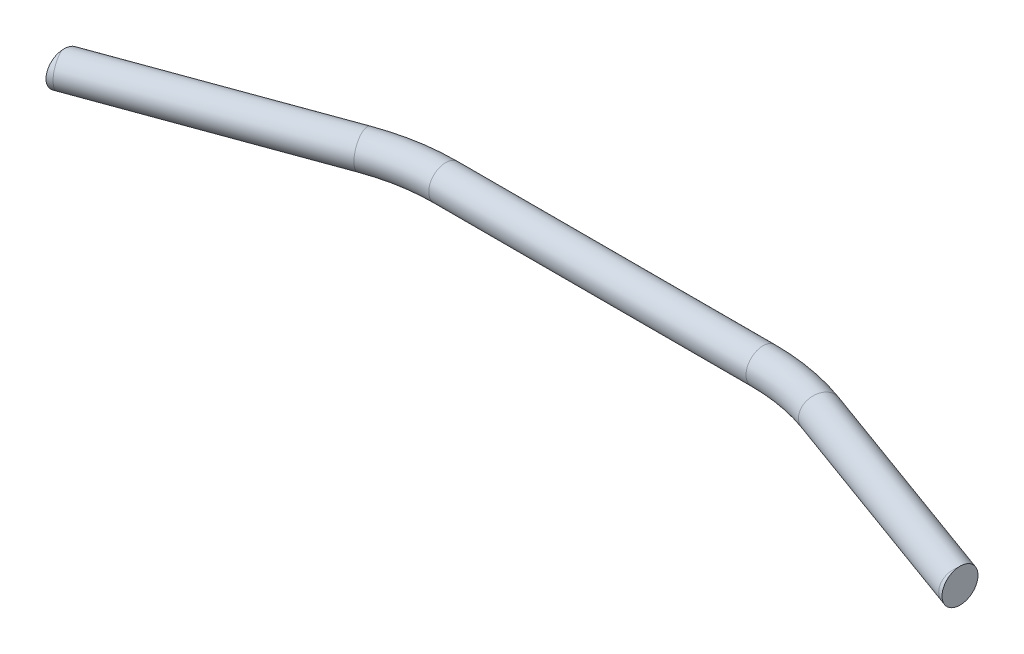
ISO-10303-21;
HEADER;
FILE_DESCRIPTION(('STEP AP214'),'2;1');
FILE_NAME('part.step','',(''),(''),'','','');
FILE_SCHEMA(('AUTOMOTIVE_DESIGN { 1 0 10303 214 1 1 1 1 }'));
ENDSEC;
DATA;
#1=APPLICATION_CONTEXT('core data for automotive mechanical design processes');
#2=APPLICATION_PROTOCOL_DEFINITION('international standard','automotive_design',2000,#1);
#3=PRODUCT_CONTEXT('',#1,'mechanical');
#4=PRODUCT('Part','Part','',(#3));
#5=PRODUCT_RELATED_PRODUCT_CATEGORY('part','',(#4));
#6=PRODUCT_DEFINITION_FORMATION('','',#4);
#7=PRODUCT_DEFINITION_CONTEXT('part definition',#1,'design');
#8=PRODUCT_DEFINITION('design','',#6,#7);
#9=PRODUCT_DEFINITION_SHAPE('','',#8);
#10=(LENGTH_UNIT() NAMED_UNIT(*) SI_UNIT(.MILLI.,.METRE.));
#11=(NAMED_UNIT(*) PLANE_ANGLE_UNIT() SI_UNIT($,.RADIAN.));
#12=(NAMED_UNIT(*) SI_UNIT($,.STERADIAN.) SOLID_ANGLE_UNIT());
#13=UNCERTAINTY_MEASURE_WITH_UNIT(LENGTH_MEASURE(1.E-05),#10,'distance_accuracy_value','');
#14=(GEOMETRIC_REPRESENTATION_CONTEXT(3) GLOBAL_UNCERTAINTY_ASSIGNED_CONTEXT((#13)) GLOBAL_UNIT_ASSIGNED_CONTEXT((#10,
#11,#12)) REPRESENTATION_CONTEXT('',''));
#15=CARTESIAN_POINT('',(0.,0.,0.));
#16=DIRECTION('',(0.,0.,1.));
#17=DIRECTION('',(1.,0.,0.));
#18=AXIS2_PLACEMENT_3D('',#15,#16,#17);
#19=CARTESIAN_POINT('',(0.,0.,0.));
#20=DIRECTION('',(1.,0.,0.));
#21=DIRECTION('',(0.,0.,-1.));
#22=AXIS2_PLACEMENT_3D('',#19,#20,#21);
#23=CYLINDRICAL_SURFACE('',#22,6.35);
#24=CARTESIAN_POINT('',(59.5888840700147,0.,0.));
#25=DIRECTION('',(-1.,0.,0.));
#26=DIRECTION('',(0.,0.,1.));
#27=AXIS2_PLACEMENT_3D('',#24,#25,#26);
#28=CIRCLE('',#27,6.35);
#29=CARTESIAN_POINT('',(59.5888840700147,0.,-6.35000000000001));
#30=VERTEX_POINT('',#29);
#31=EDGE_CURVE('E95',#30,#30,#28,.T.);
#32=ORIENTED_EDGE('',*,*,#31,.T.);
#33=EDGE_LOOP('',(#32));
#34=FACE_BOUND('',#33,.T.);
#35=CARTESIAN_POINT('',(-59.5888840700147,0.,0.));
#36=DIRECTION('',(-1.,0.,0.));
#37=DIRECTION('',(0.,0.,1.));
#38=AXIS2_PLACEMENT_3D('',#35,#36,#37);
#39=CIRCLE('',#38,6.35);
#40=CARTESIAN_POINT('',(-59.5888840700147,0.,-6.35000000000001));
#41=VERTEX_POINT('',#40);
#42=EDGE_CURVE('E90',#41,#41,#39,.F.);
#43=ORIENTED_EDGE('',*,*,#42,.T.);
#44=EDGE_LOOP('',(#43));
#45=FACE_BOUND('',#44,.T.);
#46=ADVANCED_FACE('F57',(#34,#45),#23,.T.);
#47=CARTESIAN_POINT('',(59.5888840700149,0.,76.2));
#48=DIRECTION('',(0.,-1.,0.));
#49=DIRECTION('',(0.,0.,-1.));
#50=AXIS2_PLACEMENT_3D('',#47,#48,#49);
#51=TOROIDAL_SURFACE('',#50,76.2,6.35);
#52=CARTESIAN_POINT('',(85.6508189914316,0.,4.59542229611293));
#53=DIRECTION('',(-0.939692620785908,0.,-0.342020143325669));
#54=DIRECTION('',(-0.342020143325669,0.,0.939692620785908));
#55=AXIS2_PLACEMENT_3D('',#52,#53,#54);
#56=CIRCLE('',#55,6.35);
#57=CARTESIAN_POINT('',(87.8226469015493,0.,-1.37162584587662));
#58=VERTEX_POINT('',#57);
#59=EDGE_CURVE('E103',#58,#58,#56,.T.);
#60=CARTESIAN_POINT('',(59.5888840700149,0.,76.2));
#61=DIRECTION('',(0.,-1.,0.));
#62=DIRECTION('',(0.,0.,-1.));
#63=AXIS2_PLACEMENT_3D('',#60,#61,#62);
#64=CIRCLE('',#63,82.55);
#65=EDGE_CURVE('',#30,#58,#64,.T.);
#66=ORIENTED_EDGE('',*,*,#31,.F.);
#67=ORIENTED_EDGE('',*,*,#59,.T.);
#68=ORIENTED_EDGE('',*,*,#65,.T.);
#69=ORIENTED_EDGE('',*,*,#65,.F.);
#70=EDGE_LOOP('',(#66,#68,#67,#69));
#71=FACE_BOUND('',#70,.T.);
#72=ADVANCED_FACE('F114',(#71),#51,.T.);
#73=CARTESIAN_POINT('',(85.6508189914313,0.,4.59542229611388));
#74=DIRECTION('',(0.939692620785908,0.,0.34202014332567));
#75=DIRECTION('',(0.34202014332567,0.,-0.939692620785908));
#76=AXIS2_PLACEMENT_3D('',#73,#74,#75);
#77=CYLINDRICAL_SURFACE('',#76,6.35);
#78=CARTESIAN_POINT('',(168.497770271848,0.,34.749246561888));
#79=DIRECTION('',(-0.939692620785908,0.,-0.342020143325669));
#80=DIRECTION('',(-0.342020143325669,0.,0.939692620785908));
#81=AXIS2_PLACEMENT_3D('',#78,#79,#80);
#82=CIRCLE('',#81,6.35);
#83=CARTESIAN_POINT('',(168.275,-6.31650698581566,35.361302853517));
#84=VERTEX_POINT('',#83);
#85=CARTESIAN_POINT('',(168.275,6.31650698581566,35.361302853517));
#86=VERTEX_POINT('',#85);
#87=EDGE_CURVE('E106',#84,#86,#82,.T.);
#88=ORIENTED_EDGE('',*,*,#87,.T.);
#89=CARTESIAN_POINT('',(168.275,0.,34.6681648138558));
#90=DIRECTION('',(-1.,0.,0.));
#91=DIRECTION('',(0.,0.,1.));
#92=AXIS2_PLACEMENT_3D('',#89,#90,#91);
#93=ELLIPSE('',#92,6.75752885522204,6.35);
#94=EDGE_CURVE('E77',#86,#84,#93,.T.);
#95=ORIENTED_EDGE('',*,*,#94,.T.);
#96=EDGE_LOOP('',(#88,#95));
#97=FACE_BOUND('',#96,.T.);
#98=ORIENTED_EDGE('',*,*,#59,.F.);
#99=EDGE_LOOP('',(#98));
#100=FACE_BOUND('',#99,.T.);
#101=ADVANCED_FACE('F111',(#97,#100),#77,.T.);
#102=CARTESIAN_POINT('',(168.497770271848,0.,34.7492465618881));
#103=DIRECTION('',(0.939692620785908,0.,0.342020143325669));
#104=DIRECTION('',(0.342020143325669,0.,-0.939692620785908));
#105=AXIS2_PLACEMENT_3D('',#102,#103,#104);
#106=CYLINDRICAL_SURFACE('',#105,6.35);
#107=ORIENTED_EDGE('',*,*,#87,.F.);
#108=CARTESIAN_POINT('',(168.275,0.,34.6681648138559));
#109=DIRECTION('',(-1.,0.,0.));
#110=DIRECTION('',(0.,0.,1.));
#111=AXIS2_PLACEMENT_3D('',#108,#109,#110);
#112=ELLIPSE('',#111,6.75752885522204,6.35);
#113=EDGE_CURVE('E65',#84,#86,#112,.T.);
#114=ORIENTED_EDGE('',*,*,#113,.T.);
#115=EDGE_LOOP('',(#107,#114));
#116=FACE_BOUND('',#115,.T.);
#117=ADVANCED_FACE('F59',(#116),#106,.T.);
#118=CARTESIAN_POINT('',(168.275,31.75,34.749246561888));
#119=DIRECTION('',(-1.,0.,0.));
#120=DIRECTION('',(0.,0.,1.));
#121=AXIS2_PLACEMENT_3D('',#118,#119,#120);
#122=PLANE('',#121);
#123=ORIENTED_EDGE('',*,*,#113,.F.);
#124=ORIENTED_EDGE('',*,*,#94,.F.);
#125=EDGE_LOOP('',(#123,#124));
#126=FACE_BOUND('',#125,.T.);
#127=ADVANCED_FACE('F125',(#126),#122,.F.);
#128=CARTESIAN_POINT('',(-59.5888840700149,0.,76.2));
#129=DIRECTION('',(0.,1.,0.));
#130=DIRECTION('',(0.,0.,1.));
#131=AXIS2_PLACEMENT_3D('',#128,#129,#130);
#132=TOROIDAL_SURFACE('',#131,76.2,6.35);
#133=CARTESIAN_POINT('',(-85.6508189914316,0.,4.59542229611293));
#134=DIRECTION('',(-0.939692620785908,0.,0.342020143325669));
#135=DIRECTION('',(0.342020143325669,0.,0.939692620785908));
#136=AXIS2_PLACEMENT_3D('',#133,#134,#135);
#137=CIRCLE('',#136,6.35);
#138=CARTESIAN_POINT('',(-87.8226469015493,0.,-1.37162584587662));
#139=VERTEX_POINT('',#138);
#140=EDGE_CURVE('E93',#139,#139,#137,.F.);
#141=CARTESIAN_POINT('',(-59.5888840700149,0.,76.2));
#142=DIRECTION('',(0.,1.,0.));
#143=DIRECTION('',(0.,0.,1.));
#144=AXIS2_PLACEMENT_3D('',#141,#142,#143);
#145=CIRCLE('',#144,82.55);
#146=EDGE_CURVE('',#41,#139,#145,.T.);
#147=ORIENTED_EDGE('',*,*,#42,.F.);
#148=ORIENTED_EDGE('',*,*,#140,.T.);
#149=ORIENTED_EDGE('',*,*,#146,.T.);
#150=ORIENTED_EDGE('',*,*,#146,.F.);
#151=EDGE_LOOP('',(#147,#149,#148,#150));
#152=FACE_BOUND('',#151,.T.);
#153=ADVANCED_FACE('F129',(#152),#132,.T.);
#154=CARTESIAN_POINT('',(-85.6508189914313,0.,4.59542229611388));
#155=DIRECTION('',(-0.939692620785908,0.,0.34202014332567));
#156=DIRECTION('',(0.34202014332567,0.,0.939692620785908));
#157=AXIS2_PLACEMENT_3D('',#154,#155,#156);
#158=CYLINDRICAL_SURFACE('',#157,6.35);
#159=CARTESIAN_POINT('',(-168.497770271848,0.,34.749246561888));
#160=DIRECTION('',(-0.939692620785908,0.,0.342020143325669));
#161=DIRECTION('',(0.342020143325669,0.,0.939692620785908));
#162=AXIS2_PLACEMENT_3D('',#159,#160,#161);
#163=CIRCLE('',#162,6.35);
#164=CARTESIAN_POINT('',(-168.275,6.31650698581566,35.361302853517));
#165=VERTEX_POINT('',#164);
#166=CARTESIAN_POINT('',(-168.275,-6.31650698581566,35.361302853517));
#167=VERTEX_POINT('',#166);
#168=EDGE_CURVE('E89',#165,#167,#163,.F.);
#169=ORIENTED_EDGE('',*,*,#168,.T.);
#170=CARTESIAN_POINT('',(-168.275,0.,34.6681648138558));
#171=DIRECTION('',(1.,0.,0.));
#172=DIRECTION('',(0.,0.,1.));
#173=AXIS2_PLACEMENT_3D('',#170,#171,#172);
#174=ELLIPSE('',#173,6.75752885522204,6.35);
#175=EDGE_CURVE('E71',#167,#165,#174,.T.);
#176=ORIENTED_EDGE('',*,*,#175,.T.);
#177=EDGE_LOOP('',(#169,#176));
#178=FACE_BOUND('',#177,.T.);
#179=ORIENTED_EDGE('',*,*,#140,.F.);
#180=EDGE_LOOP('',(#179));
#181=FACE_BOUND('',#180,.T.);
#182=ADVANCED_FACE('F87',(#178,#181),#158,.T.);
#183=CARTESIAN_POINT('',(-168.497770271848,0.,34.7492465618881));
#184=DIRECTION('',(-0.939692620785908,0.,0.342020143325669));
#185=DIRECTION('',(0.342020143325669,0.,0.939692620785908));
#186=AXIS2_PLACEMENT_3D('',#183,#184,#185);
#187=CYLINDRICAL_SURFACE('',#186,6.35);
#188=ORIENTED_EDGE('',*,*,#168,.F.);
#189=CARTESIAN_POINT('',(-168.275,0.,34.6681648138559));
#190=DIRECTION('',(1.,0.,0.));
#191=DIRECTION('',(0.,0.,1.));
#192=AXIS2_PLACEMENT_3D('',#189,#190,#191);
#193=ELLIPSE('',#192,6.75752885522204,6.35);
#194=EDGE_CURVE('E12',#165,#167,#193,.T.);
#195=ORIENTED_EDGE('',*,*,#194,.T.);
#196=EDGE_LOOP('',(#188,#195));
#197=FACE_BOUND('',#196,.T.);
#198=ADVANCED_FACE('F92',(#197),#187,.T.);
#199=CARTESIAN_POINT('',(-168.275,31.75,34.749246561888));
#200=DIRECTION('',(1.,0.,0.));
#201=DIRECTION('',(0.,0.,1.));
#202=AXIS2_PLACEMENT_3D('',#199,#200,#201);
#203=PLANE('',#202);
#204=ORIENTED_EDGE('',*,*,#194,.F.);
#205=ORIENTED_EDGE('',*,*,#175,.F.);
#206=EDGE_LOOP('',(#204,#205));
#207=FACE_BOUND('',#206,.T.);
#208=ADVANCED_FACE('F82',(#207),#203,.F.);
#209=CLOSED_SHELL('',(#46,#72,#101,#117,#127,#153,#182,#198,#208));
#210=MANIFOLD_SOLID_BREP('B2',#209);
#211=ADVANCED_BREP_SHAPE_REPRESENTATION('',(#18,#210),#14);
#212=SHAPE_DEFINITION_REPRESENTATION(#9,#211);
ENDSEC;
END-ISO-10303-21;
